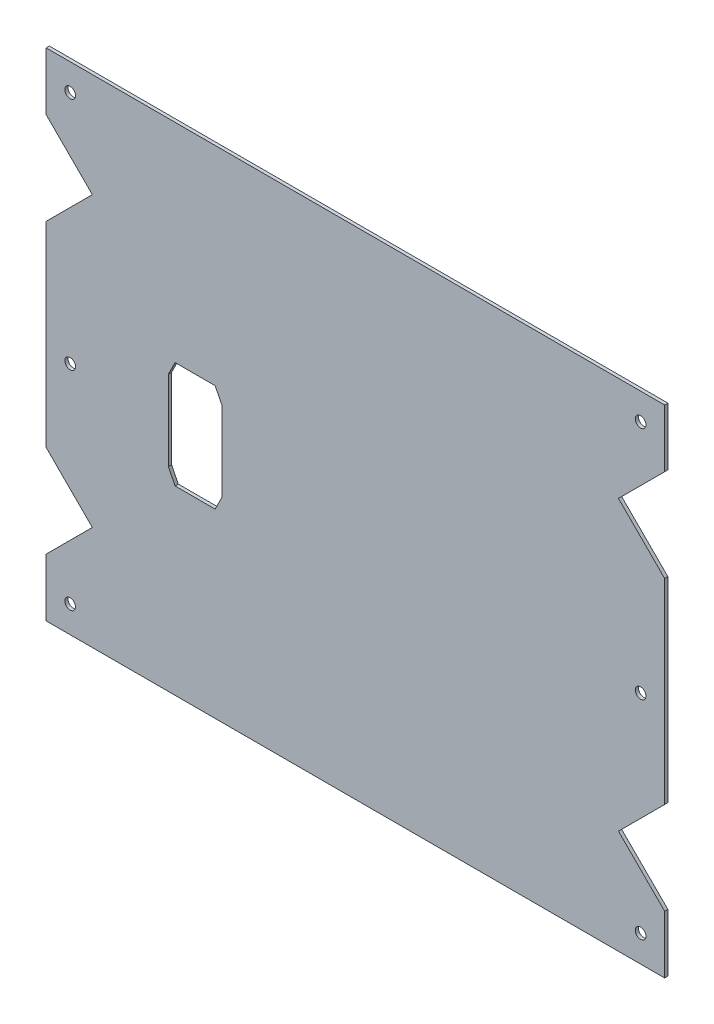
ISO-10303-21;
HEADER;
FILE_DESCRIPTION(('STEP AP214'),'2;1');
FILE_NAME('part.step','',(''),(''),'','','');
FILE_SCHEMA(('AUTOMOTIVE_DESIGN { 1 0 10303 214 1 1 1 1 }'));
ENDSEC;
DATA;
#1=APPLICATION_CONTEXT('core data for automotive mechanical design processes');
#2=APPLICATION_PROTOCOL_DEFINITION('international standard','automotive_design',2000,#1);
#3=PRODUCT_CONTEXT('',#1,'mechanical');
#4=PRODUCT('Part','Part','',(#3));
#5=PRODUCT_RELATED_PRODUCT_CATEGORY('part','',(#4));
#6=PRODUCT_DEFINITION_FORMATION('','',#4);
#7=PRODUCT_DEFINITION_CONTEXT('part definition',#1,'design');
#8=PRODUCT_DEFINITION('design','',#6,#7);
#9=PRODUCT_DEFINITION_SHAPE('','',#8);
#10=(LENGTH_UNIT() NAMED_UNIT(*) SI_UNIT(.MILLI.,.METRE.));
#11=(NAMED_UNIT(*) PLANE_ANGLE_UNIT() SI_UNIT($,.RADIAN.));
#12=(NAMED_UNIT(*) SI_UNIT($,.STERADIAN.) SOLID_ANGLE_UNIT());
#13=UNCERTAINTY_MEASURE_WITH_UNIT(LENGTH_MEASURE(1.E-05),#10,'distance_accuracy_value','');
#14=(GEOMETRIC_REPRESENTATION_CONTEXT(3) GLOBAL_UNCERTAINTY_ASSIGNED_CONTEXT((#13)) GLOBAL_UNIT_ASSIGNED_CONTEXT((#10,
#11,#12)) REPRESENTATION_CONTEXT('',''));
#15=CARTESIAN_POINT('',(0.,0.,0.));
#16=DIRECTION('',(0.,0.,1.));
#17=DIRECTION('',(1.,0.,0.));
#18=AXIS2_PLACEMENT_3D('',#15,#16,#17);
#19=CARTESIAN_POINT('',(0.,0.,1.2));
#20=DIRECTION('',(0.,0.,-1.));
#21=DIRECTION('',(-1.,0.,0.));
#22=AXIS2_PLACEMENT_3D('',#19,#20,#21);
#23=PLANE('',#22);
#24=DIRECTION('',(-0.707106781186554,0.707106781186541,0.));
#25=VECTOR('',#24,1.);
#26=CARTESIAN_POINT('',(207.565505420985,99.8549233047102,1.19999999999998));
#27=LINE('',#26,#25);
#28=CARTESIAN_POINT('',(215.773982116275,91.6464466094206,1.1999999999999));
#29=VERTEX_POINT('',#28);
#30=CARTESIAN_POINT('',(198.476911543767,108.943517181929,1.20000000000001));
#31=VERTEX_POINT('',#30);
#32=EDGE_CURVE('E709',#29,#31,#27,.T.);
#33=ORIENTED_EDGE('',*,*,#32,.T.);
#34=DIRECTION('',(0.707106781186549,0.707106781186546,0.));
#35=VECTOR('',#34,1.);
#36=CARTESIAN_POINT('',(226.597205420968,137.063811059131,1.19999999999942));
#37=LINE('',#36,#35);
#38=CARTESIAN_POINT('',(215.773982116275,126.240587754437,1.19999999999951));
#39=VERTEX_POINT('',#38);
#40=EDGE_CURVE('E624',#31,#39,#37,.T.);
#41=ORIENTED_EDGE('',*,*,#40,.T.);
#42=DIRECTION('',(0.,1.,0.));
#43=VECTOR('',#42,1.);
#44=CARTESIAN_POINT('',(215.773982116275,147.887034363824,1.19999999999935));
#45=LINE('',#44,#43);
#46=CARTESIAN_POINT('',(215.773982116275,147.887034363824,1.19999999999935));
#47=VERTEX_POINT('',#46);
#48=EDGE_CURVE('E630',#47,#39,#45,.F.);
#49=ORIENTED_EDGE('',*,*,#48,.F.);
#50=DIRECTION('',(1.,0.,0.));
#51=VECTOR('',#50,1.);
#52=CARTESIAN_POINT('',(215.773982116275,147.887034363824,1.19999999999935));
#53=LINE('',#52,#51);
#54=CARTESIAN_POINT('',(-15.7739821162846,147.887034363824,1.19999999999833));
#55=VERTEX_POINT('',#54);
#56=EDGE_CURVE('E622',#47,#55,#53,.F.);
#57=ORIENTED_EDGE('',*,*,#56,.T.);
#58=DIRECTION('',(0.,1.,0.));
#59=VECTOR('',#58,1.);
#60=CARTESIAN_POINT('',(-15.7739821162847,109.823634363824,1.19999999999913));
#61=LINE('',#60,#59);
#62=CARTESIAN_POINT('',(-15.7739821162846,126.240587754444,1.19999999999877));
#63=VERTEX_POINT('',#62);
#64=EDGE_CURVE('E641',#63,#55,#61,.T.);
#65=ORIENTED_EDGE('',*,*,#64,.F.);
#66=DIRECTION('',(0.707106781186559,-0.707106781186536,0.));
#67=VECTOR('',#66,1.);
#68=CARTESIAN_POINT('',(-7.56550542097494,118.032111059134,1.19999999999894));
#69=LINE('',#68,#67);
#70=CARTESIAN_POINT('',(1.52308845622177,108.943517181938,1.19999999999915));
#71=VERTEX_POINT('',#70);
#72=EDGE_CURVE('E620',#63,#71,#69,.T.);
#73=ORIENTED_EDGE('',*,*,#72,.T.);
#74=DIRECTION('',(-0.707106781186544,-0.707106781186551,0.));
#75=VECTOR('',#74,1.);
#76=CARTESIAN_POINT('',(-60.6289054210005,46.791523304715,1.19999999999919));
#77=LINE('',#76,#75);
#78=CARTESIAN_POINT('',(-15.7739821162848,91.6464466094312,1.19999999999887));
#79=VERTEX_POINT('',#78);
#80=EDGE_CURVE('E735',#71,#79,#77,.T.);
#81=ORIENTED_EDGE('',*,*,#80,.T.);
#82=DIRECTION('',(0.,1.,0.));
#83=VECTOR('',#82,1.);
#84=CARTESIAN_POINT('',(-15.7739821162851,1.93659999999996,1.1999999999995));
#85=LINE('',#84,#83);
#86=CARTESIAN_POINT('',(-15.773982116285,18.3535533906197,1.19999999999939));
#87=VERTEX_POINT('',#86);
#88=EDGE_CURVE('E741',#87,#79,#85,.T.);
#89=ORIENTED_EDGE('',*,*,#88,.F.);
#90=DIRECTION('',(0.707106781186547,-0.707106781186548,0.));
#91=VECTOR('',#90,1.);
#92=CARTESIAN_POINT('',(-7.56550542097516,10.1450766953098,1.19999999999944));
#93=LINE('',#92,#91);
#94=CARTESIAN_POINT('',(1.52308845624361,1.05648281809099,1.19999999999951));
#95=VERTEX_POINT('',#94);
#96=EDGE_CURVE('E733',#87,#95,#93,.T.);
#97=ORIENTED_EDGE('',*,*,#96,.T.);
#98=DIRECTION('',(-0.707106781186556,-0.707106781186539,0.));
#99=VECTOR('',#98,1.);
#100=CARTESIAN_POINT('',(-26.5972054209785,-27.0638110591305,1.19999999999894));
#101=LINE('',#100,#99);
#102=CARTESIAN_POINT('',(-15.7739821162848,-16.240587754437,1.19999999999902));
#103=VERTEX_POINT('',#102);
#104=EDGE_CURVE('E599',#95,#103,#101,.T.);
#105=ORIENTED_EDGE('',*,*,#104,.T.);
#106=DIRECTION('',(0.,1.,0.));
#107=VECTOR('',#106,1.);
#108=CARTESIAN_POINT('',(-15.7739821162848,-37.8870343638244,1.19999999999887));
#109=LINE('',#108,#107);
#110=CARTESIAN_POINT('',(-15.7739821162848,-37.8870343638244,1.19999999999887));
#111=VERTEX_POINT('',#110);
#112=EDGE_CURVE('E672',#111,#103,#109,.T.);
#113=ORIENTED_EDGE('',*,*,#112,.F.);
#114=DIRECTION('',(1.,0.,0.));
#115=VECTOR('',#114,1.);
#116=CARTESIAN_POINT('',(215.773982116274,-37.8870343638244,1.19999999999882));
#117=LINE('',#116,#115);
#118=CARTESIAN_POINT('',(215.773982116275,-37.8870343638241,1.19999999999882));
#119=VERTEX_POINT('',#118);
#120=EDGE_CURVE('E663',#111,#119,#117,.T.);
#121=ORIENTED_EDGE('',*,*,#120,.T.);
#122=DIRECTION('',(0.,1.,0.));
#123=VECTOR('',#122,1.);
#124=CARTESIAN_POINT('',(215.773982116275,0.176365636175637,1.19999999999962));
#125=LINE('',#124,#123);
#126=CARTESIAN_POINT('',(215.773982116275,-16.2405877544436,1.19999999999929));
#127=VERTEX_POINT('',#126);
#128=EDGE_CURVE('E681',#127,#119,#125,.F.);
#129=ORIENTED_EDGE('',*,*,#128,.F.);
#130=DIRECTION('',(-0.707106781186566,0.707106781186529,0.));
#131=VECTOR('',#130,1.);
#132=CARTESIAN_POINT('',(207.565505420965,-8.03211105913442,1.19999999999948));
#133=LINE('',#132,#131);
#134=CARTESIAN_POINT('',(198.476911543749,1.05648281808136,1.19999999999964));
#135=VERTEX_POINT('',#134);
#136=EDGE_CURVE('E666',#127,#135,#133,.T.);
#137=ORIENTED_EDGE('',*,*,#136,.T.);
#138=DIRECTION('',(0.707106781186537,0.707106781186558,0.));
#139=VECTOR('',#138,1.);
#140=CARTESIAN_POINT('',(260.628905420971,63.2084766953055,1.19999999999973));
#141=LINE('',#140,#139);
#142=CARTESIAN_POINT('',(215.773982116275,18.353553390608,1.1999999999994));
#143=VERTEX_POINT('',#142);
#144=EDGE_CURVE('E711',#135,#143,#141,.T.);
#145=ORIENTED_EDGE('',*,*,#144,.T.);
#146=DIRECTION('',(0.,1.,0.));
#147=VECTOR('',#146,1.);
#148=CARTESIAN_POINT('',(215.773982116275,108.0634,1.20000000000001));
#149=LINE('',#148,#147);
#150=EDGE_CURVE('E720',#29,#143,#149,.F.);
#151=ORIENTED_EDGE('',*,*,#150,.F.);
#152=EDGE_LOOP('',(#33,#41,#49,#57,#65,#73,#81,#89,#97,#105,#113,#121,#129,#137,#145,#151));
#153=FACE_BOUND('',#152,.T.);
#154=DIRECTION('',(0.44721359549996,-0.894427190999915,0.));
#155=VECTOR('',#154,1.);
#156=CARTESIAN_POINT('',(32.5,30.,1.2));
#157=LINE('',#156,#155);
#158=CARTESIAN_POINT('',(30.,35.,1.2));
#159=VERTEX_POINT('',#158);
#160=CARTESIAN_POINT('',(32.5,30.,1.2));
#161=VERTEX_POINT('',#160);
#162=EDGE_CURVE('E745',#159,#161,#157,.T.);
#163=ORIENTED_EDGE('',*,*,#162,.F.);
#164=DIRECTION('',(0.,-1.,0.));
#165=VECTOR('',#164,1.);
#166=CARTESIAN_POINT('',(30.,35.,1.2));
#167=LINE('',#166,#165);
#168=CARTESIAN_POINT('',(30.,65.,1.2));
#169=VERTEX_POINT('',#168);
#170=EDGE_CURVE('E760',#169,#159,#167,.T.);
#171=ORIENTED_EDGE('',*,*,#170,.F.);
#172=DIRECTION('',(-0.447213595499958,-0.894427190999916,0.));
#173=VECTOR('',#172,1.);
#174=CARTESIAN_POINT('',(30.,65.,1.2));
#175=LINE('',#174,#173);
#176=CARTESIAN_POINT('',(32.5,70.,1.2));
#177=VERTEX_POINT('',#176);
#178=EDGE_CURVE('E758',#177,#169,#175,.T.);
#179=ORIENTED_EDGE('',*,*,#178,.F.);
#180=DIRECTION('',(-1.,0.,0.));
#181=VECTOR('',#180,1.);
#182=CARTESIAN_POINT('',(32.5,70.,1.2));
#183=LINE('',#182,#181);
#184=CARTESIAN_POINT('',(47.5,70.,1.2));
#185=VERTEX_POINT('',#184);
#186=EDGE_CURVE('E756',#185,#177,#183,.T.);
#187=ORIENTED_EDGE('',*,*,#186,.F.);
#188=DIRECTION('',(-0.447213595499958,0.894427190999916,0.));
#189=VECTOR('',#188,1.);
#190=CARTESIAN_POINT('',(47.5,70.,1.2));
#191=LINE('',#190,#189);
#192=CARTESIAN_POINT('',(50.,65.,1.2));
#193=VERTEX_POINT('',#192);
#194=EDGE_CURVE('E754',#193,#185,#191,.T.);
#195=ORIENTED_EDGE('',*,*,#194,.F.);
#196=DIRECTION('',(0.,1.,0.));
#197=VECTOR('',#196,1.);
#198=CARTESIAN_POINT('',(50.,65.,1.2));
#199=LINE('',#198,#197);
#200=CARTESIAN_POINT('',(50.,35.,1.2));
#201=VERTEX_POINT('',#200);
#202=EDGE_CURVE('E752',#201,#193,#199,.T.);
#203=ORIENTED_EDGE('',*,*,#202,.F.);
#204=DIRECTION('',(0.447213595499959,0.894427190999915,0.));
#205=VECTOR('',#204,1.);
#206=CARTESIAN_POINT('',(50.,35.,1.2));
#207=LINE('',#206,#205);
#208=CARTESIAN_POINT('',(47.5,30.,1.2));
#209=VERTEX_POINT('',#208);
#210=EDGE_CURVE('E750',#209,#201,#207,.T.);
#211=ORIENTED_EDGE('',*,*,#210,.F.);
#212=DIRECTION('',(1.,0.,0.));
#213=VECTOR('',#212,1.);
#214=CARTESIAN_POINT('',(47.5,30.,1.2));
#215=LINE('',#214,#213);
#216=EDGE_CURVE('E747',#161,#209,#215,.T.);
#217=ORIENTED_EDGE('',*,*,#216,.F.);
#218=EDGE_LOOP('',(#163,#171,#179,#187,#195,#203,#211,#217));
#219=FACE_BOUND('',#218,.T.);
#220=CARTESIAN_POINT('',(-6.77398211628597,49.9999999999993,1.19999999999917));
#221=DIRECTION('',(0.,0.,1.));
#222=DIRECTION('',(1.,0.,0.));
#223=AXIS2_PLACEMENT_3D('',#220,#221,#222);
#224=CIRCLE('',#223,2.);
#225=CARTESIAN_POINT('',(-4.77398211628597,49.9999999999993,1.19999999999917));
#226=VERTEX_POINT('',#225);
#227=EDGE_CURVE('E738',#226,#226,#224,.T.);
#228=ORIENTED_EDGE('',*,*,#227,.F.);
#229=EDGE_LOOP('',(#228));
#230=FACE_BOUND('',#229,.T.);
#231=CARTESIAN_POINT('',(206.773982116151,49.9999999999994,1.19999999999959));
#232=DIRECTION('',(0.,0.,1.));
#233=DIRECTION('',(1.,0.,0.));
#234=AXIS2_PLACEMENT_3D('',#231,#232,#233);
#235=CIRCLE('',#234,2.);
#236=CARTESIAN_POINT('',(208.773982116151,49.9999999999994,1.19999999999959));
#237=VERTEX_POINT('',#236);
#238=EDGE_CURVE('E717',#237,#237,#235,.T.);
#239=ORIENTED_EDGE('',*,*,#238,.F.);
#240=EDGE_LOOP('',(#239));
#241=FACE_BOUND('',#240,.T.);
#242=CARTESIAN_POINT('',(-6.77398211628428,-27.8870343639498,1.19999999999893));
#243=DIRECTION('',(0.,0.,1.));
#244=DIRECTION('',(0.,1.,0.));
#245=AXIS2_PLACEMENT_3D('',#242,#243,#244);
#246=CIRCLE('',#245,2.);
#247=CARTESIAN_POINT('',(-6.77398211628427,-25.8870343639498,1.19999999999895));
#248=VERTEX_POINT('',#247);
#249=EDGE_CURVE('E686',#248,#248,#246,.T.);
#250=ORIENTED_EDGE('',*,*,#249,.F.);
#251=EDGE_LOOP('',(#250));
#252=FACE_BOUND('',#251,.T.);
#253=CARTESIAN_POINT('',(206.773982116274,-27.887034363825,1.19999999999905));
#254=DIRECTION('',(0.,0.,1.));
#255=DIRECTION('',(-1.,0.,0.));
#256=AXIS2_PLACEMENT_3D('',#253,#254,#255);
#257=CIRCLE('',#256,2.);
#258=CARTESIAN_POINT('',(204.773982116274,-27.887034363825,1.19999999999905));
#259=VERTEX_POINT('',#258);
#260=EDGE_CURVE('E614',#259,#259,#257,.T.);
#261=ORIENTED_EDGE('',*,*,#260,.F.);
#262=EDGE_LOOP('',(#261));
#263=FACE_BOUND('',#262,.T.);
#264=CARTESIAN_POINT('',(-6.77398211628501,137.88703436395,1.19999999999852));
#265=DIRECTION('',(0.,0.,1.));
#266=DIRECTION('',(0.,-1.,0.));
#267=AXIS2_PLACEMENT_3D('',#264,#265,#266);
#268=CIRCLE('',#267,2.);
#269=CARTESIAN_POINT('',(-6.77398211628497,135.88703436395,1.19999999999856));
#270=VERTEX_POINT('',#269);
#271=EDGE_CURVE('E651',#270,#270,#268,.T.);
#272=ORIENTED_EDGE('',*,*,#271,.F.);
#273=EDGE_LOOP('',(#272));
#274=FACE_BOUND('',#273,.T.);
#275=CARTESIAN_POINT('',(206.773982116274,137.887034363825,1.19999999999941));
#276=DIRECTION('',(0.,0.,1.));
#277=DIRECTION('',(1.,0.,0.));
#278=AXIS2_PLACEMENT_3D('',#275,#276,#277);
#279=CIRCLE('',#278,2.);
#280=CARTESIAN_POINT('',(208.773982116274,137.887034363825,1.19999999999941));
#281=VERTEX_POINT('',#280);
#282=EDGE_CURVE('E611',#281,#281,#279,.T.);
#283=ORIENTED_EDGE('',*,*,#282,.F.);
#284=EDGE_LOOP('',(#283));
#285=FACE_BOUND('',#284,.T.);
#286=ADVANCED_FACE('F411',(#153,#219,#230,#241,#252,#263,#274,#285),#23,.F.);
#287=CARTESIAN_POINT('',(0.,0.,0.));
#288=DIRECTION('',(0.,0.,-1.));
#289=DIRECTION('',(-1.,0.,0.));
#290=AXIS2_PLACEMENT_3D('',#287,#288,#289);
#291=PLANE('',#290);
#292=DIRECTION('',(0.707106781186549,0.707106781186546,0.));
#293=VECTOR('',#292,1.);
#294=CARTESIAN_POINT('',(226.597205420968,137.063811059131,-5.82867087928207E-13));
#295=LINE('',#294,#293);
#296=CARTESIAN_POINT('',(198.476911543767,108.943517181929,0.));
#297=VERTEX_POINT('',#296);
#298=CARTESIAN_POINT('',(215.773982116275,126.240587754437,-4.9960036108132E-13));
#299=VERTEX_POINT('',#298);
#300=EDGE_CURVE('E615',#297,#299,#295,.T.);
#301=ORIENTED_EDGE('',*,*,#300,.F.);
#302=DIRECTION('',(-0.707106781186554,0.707106781186541,0.));
#303=VECTOR('',#302,1.);
#304=CARTESIAN_POINT('',(207.565505420985,99.8549233047102,0.));
#305=LINE('',#304,#303);
#306=CARTESIAN_POINT('',(215.773982116275,91.6464466094206,-1.11022302462516E-13));
#307=VERTEX_POINT('',#306);
#308=EDGE_CURVE('E699',#307,#297,#305,.T.);
#309=ORIENTED_EDGE('',*,*,#308,.F.);
#310=DIRECTION('',(0.,1.,0.));
#311=VECTOR('',#310,1.);
#312=CARTESIAN_POINT('',(215.773982116275,108.0634,0.));
#313=LINE('',#312,#311);
#314=CARTESIAN_POINT('',(215.773982116275,18.353553390608,-6.10622663543836E-13));
#315=VERTEX_POINT('',#314);
#316=EDGE_CURVE('E701',#307,#315,#313,.F.);
#317=ORIENTED_EDGE('',*,*,#316,.T.);
#318=DIRECTION('',(0.707106781186537,0.707106781186558,0.));
#319=VECTOR('',#318,1.);
#320=CARTESIAN_POINT('',(260.628905420971,63.2084766953055,-2.77555756156289E-13));
#321=LINE('',#320,#319);
#322=CARTESIAN_POINT('',(198.476911543749,1.05648281808139,-3.6125616387217E-13));
#323=VERTEX_POINT('',#322);
#324=EDGE_CURVE('E706',#323,#315,#321,.T.);
#325=ORIENTED_EDGE('',*,*,#324,.F.);
#326=DIRECTION('',(-0.707106781186566,0.707106781186529,0.));
#327=VECTOR('',#326,1.);
#328=CARTESIAN_POINT('',(207.565505420965,-8.0321110591344,-5.23506247317324E-13));
#329=LINE('',#328,#327);
#330=CARTESIAN_POINT('',(215.773982116275,-16.2405877544436,-7.19907650602707E-13));
#331=VERTEX_POINT('',#330);
#332=EDGE_CURVE('E594',#331,#323,#329,.T.);
#333=ORIENTED_EDGE('',*,*,#332,.F.);
#334=DIRECTION('',(0.,1.,0.));
#335=VECTOR('',#334,1.);
#336=CARTESIAN_POINT('',(215.773982116275,0.176365636175661,-3.85032408042413E-13));
#337=LINE('',#336,#335);
#338=CARTESIAN_POINT('',(215.773982116275,-37.8870343638241,-1.18406387361043E-12));
#339=VERTEX_POINT('',#338);
#340=EDGE_CURVE('E678',#331,#339,#337,.F.);
#341=ORIENTED_EDGE('',*,*,#340,.T.);
#342=DIRECTION('',(1.,0.,0.));
#343=VECTOR('',#342,1.);
#344=CARTESIAN_POINT('',(215.773982116274,-37.8870343638244,-1.18406387361043E-12));
#345=LINE('',#344,#343);
#346=CARTESIAN_POINT('',(-15.7739821162848,-37.8870343638244,-1.13438163367224E-12));
#347=VERTEX_POINT('',#346);
#348=EDGE_CURVE('E691',#347,#339,#345,.T.);
#349=ORIENTED_EDGE('',*,*,#348,.F.);
#350=DIRECTION('',(0.,1.,0.));
#351=VECTOR('',#350,1.);
#352=CARTESIAN_POINT('',(-15.7739821162848,-37.8870343638244,-1.13438163367224E-12));
#353=LINE('',#352,#351);
#354=CARTESIAN_POINT('',(-15.7739821162848,-16.240587754437,-9.83334098929737E-13));
#355=VERTEX_POINT('',#354);
#356=EDGE_CURVE('E591',#347,#355,#353,.T.);
#357=ORIENTED_EDGE('',*,*,#356,.T.);
#358=DIRECTION('',(-0.707106781186556,-0.707106781186539,0.));
#359=VECTOR('',#358,1.);
#360=CARTESIAN_POINT('',(-26.5972054209785,-27.0638110591305,-1.0566020638446E-12));
#361=LINE('',#360,#359);
#362=CARTESIAN_POINT('',(1.52308845624361,1.05648281809098,-4.93095148046407E-13));
#363=VERTEX_POINT('',#362);
#364=EDGE_CURVE('E587',#363,#355,#361,.T.);
#365=ORIENTED_EDGE('',*,*,#364,.F.);
#366=DIRECTION('',(0.707106781186547,-0.707106781186548,0.));
#367=VECTOR('',#366,1.);
#368=CARTESIAN_POINT('',(-7.56550542097516,10.1450766953098,-5.56016695999748E-13));
#369=LINE('',#368,#367);
#370=CARTESIAN_POINT('',(-15.773982116285,18.3535533906197,-6.12874813590876E-13));
#371=VERTEX_POINT('',#370);
#372=EDGE_CURVE('E573',#371,#363,#369,.T.);
#373=ORIENTED_EDGE('',*,*,#372,.F.);
#374=DIRECTION('',(0.,1.,0.));
#375=VECTOR('',#374,1.);
#376=CARTESIAN_POINT('',(-15.7739821162851,1.93659999999995,-4.98153329937543E-13));
#377=LINE('',#376,#375);
#378=CARTESIAN_POINT('',(-15.7739821162848,91.6464466094312,-1.125044718155E-12));
#379=VERTEX_POINT('',#378);
#380=EDGE_CURVE('E583',#371,#379,#377,.T.);
#381=ORIENTED_EDGE('',*,*,#380,.T.);
#382=DIRECTION('',(-0.707106781186544,-0.707106781186551,0.));
#383=VECTOR('',#382,1.);
#384=CARTESIAN_POINT('',(-60.6289054210005,46.791523304715,-8.08852452133712E-13));
#385=LINE('',#384,#383);
#386=CARTESIAN_POINT('',(1.52308845622177,108.943517181938,-8.50231343663133E-13));
#387=VERTEX_POINT('',#386);
#388=EDGE_CURVE('E730',#387,#379,#385,.T.);
#389=ORIENTED_EDGE('',*,*,#388,.F.);
#390=DIRECTION('',(0.707106781186559,-0.707106781186536,0.));
#391=VECTOR('',#390,1.);
#392=CARTESIAN_POINT('',(-7.56550542097494,118.032111059134,-1.0547118733939E-12));
#393=LINE('',#392,#391);
#394=CARTESIAN_POINT('',(-15.7739821162846,126.240587754444,-1.23512311489549E-12));
#395=VERTEX_POINT('',#394);
#396=EDGE_CURVE('E618',#395,#387,#393,.T.);
#397=ORIENTED_EDGE('',*,*,#396,.F.);
#398=DIRECTION('',(0.,1.,0.));
#399=VECTOR('',#398,1.);
#400=CARTESIAN_POINT('',(-15.7739821162847,109.823634363824,-8.74300631892311E-13));
#401=LINE('',#400,#399);
#402=CARTESIAN_POINT('',(-15.7739821162846,147.887034363824,-1.67921232474555E-12));
#403=VERTEX_POINT('',#402);
#404=EDGE_CURVE('E635',#395,#403,#401,.T.);
#405=ORIENTED_EDGE('',*,*,#404,.T.);
#406=DIRECTION('',(1.,0.,0.));
#407=VECTOR('',#406,1.);
#408=CARTESIAN_POINT('',(215.773982116275,147.887034363824,-6.52256026967279E-13));
#409=LINE('',#408,#407);
#410=CARTESIAN_POINT('',(215.773982116275,147.887034363824,-6.52256026967279E-13));
#411=VERTEX_POINT('',#410);
#412=EDGE_CURVE('E649',#411,#403,#409,.F.);
#413=ORIENTED_EDGE('',*,*,#412,.F.);
#414=DIRECTION('',(0.,1.,0.));
#415=VECTOR('',#414,1.);
#416=CARTESIAN_POINT('',(215.773982116275,147.887034363824,-6.52256026967279E-13));
#417=LINE('',#416,#415);
#418=EDGE_CURVE('E627',#411,#299,#417,.F.);
#419=ORIENTED_EDGE('',*,*,#418,.T.);
#420=EDGE_LOOP('',(#301,#309,#317,#325,#333,#341,#349,#357,#365,#373,#381,#389,#397,#405,#413,#419));
#421=FACE_BOUND('',#420,.T.);
#422=DIRECTION('',(0.,-1.,0.));
#423=VECTOR('',#422,1.);
#424=CARTESIAN_POINT('',(30.,35.,0.));
#425=LINE('',#424,#423);
#426=CARTESIAN_POINT('',(30.,65.,0.));
#427=VERTEX_POINT('',#426);
#428=CARTESIAN_POINT('',(30.,35.,0.));
#429=VERTEX_POINT('',#428);
#430=EDGE_CURVE('E748',#427,#429,#425,.T.);
#431=ORIENTED_EDGE('',*,*,#430,.T.);
#432=DIRECTION('',(0.44721359549996,-0.894427190999915,0.));
#433=VECTOR('',#432,1.);
#434=CARTESIAN_POINT('',(32.5,30.,0.));
#435=LINE('',#434,#433);
#436=CARTESIAN_POINT('',(32.5,30.,0.));
#437=VERTEX_POINT('',#436);
#438=EDGE_CURVE('E433',#429,#437,#435,.T.);
#439=ORIENTED_EDGE('',*,*,#438,.T.);
#440=DIRECTION('',(1.,0.,0.));
#441=VECTOR('',#440,1.);
#442=CARTESIAN_POINT('',(47.5,30.,0.));
#443=LINE('',#442,#441);
#444=CARTESIAN_POINT('',(47.5,30.,0.));
#445=VERTEX_POINT('',#444);
#446=EDGE_CURVE('E764',#437,#445,#443,.T.);
#447=ORIENTED_EDGE('',*,*,#446,.T.);
#448=DIRECTION('',(0.447213595499959,0.894427190999915,0.));
#449=VECTOR('',#448,1.);
#450=CARTESIAN_POINT('',(50.,35.,0.));
#451=LINE('',#450,#449);
#452=CARTESIAN_POINT('',(50.,35.,0.));
#453=VERTEX_POINT('',#452);
#454=EDGE_CURVE('E767',#445,#453,#451,.T.);
#455=ORIENTED_EDGE('',*,*,#454,.T.);
#456=DIRECTION('',(0.,1.,0.));
#457=VECTOR('',#456,1.);
#458=CARTESIAN_POINT('',(50.,65.,0.));
#459=LINE('',#458,#457);
#460=CARTESIAN_POINT('',(50.,65.,0.));
#461=VERTEX_POINT('',#460);
#462=EDGE_CURVE('E770',#453,#461,#459,.T.);
#463=ORIENTED_EDGE('',*,*,#462,.T.);
#464=DIRECTION('',(-0.447213595499958,0.894427190999916,0.));
#465=VECTOR('',#464,1.);
#466=CARTESIAN_POINT('',(47.5,70.,0.));
#467=LINE('',#466,#465);
#468=CARTESIAN_POINT('',(47.5,70.,0.));
#469=VERTEX_POINT('',#468);
#470=EDGE_CURVE('E773',#461,#469,#467,.T.);
#471=ORIENTED_EDGE('',*,*,#470,.T.);
#472=DIRECTION('',(-1.,0.,0.));
#473=VECTOR('',#472,1.);
#474=CARTESIAN_POINT('',(32.5,70.,0.));
#475=LINE('',#474,#473);
#476=CARTESIAN_POINT('',(32.5,70.,0.));
#477=VERTEX_POINT('',#476);
#478=EDGE_CURVE('E776',#469,#477,#475,.T.);
#479=ORIENTED_EDGE('',*,*,#478,.T.);
#480=DIRECTION('',(-0.447213595499958,-0.894427190999916,0.));
#481=VECTOR('',#480,1.);
#482=CARTESIAN_POINT('',(30.,65.,0.));
#483=LINE('',#482,#481);
#484=EDGE_CURVE('E779',#477,#427,#483,.T.);
#485=ORIENTED_EDGE('',*,*,#484,.T.);
#486=EDGE_LOOP('',(#431,#439,#447,#455,#463,#471,#479,#485));
#487=FACE_BOUND('',#486,.T.);
#488=CARTESIAN_POINT('',(-6.77398211628673,49.9999999999993,-2.04577628740258E-11));
#489=DIRECTION('',(6.3072958938397E-13,0.,1.));
#490=DIRECTION('',(1.,0.,-6.3072958938397E-13));
#491=AXIS2_PLACEMENT_3D('',#488,#489,#490);
#492=CIRCLE('',#491,2.);
#493=CARTESIAN_POINT('',(-4.77398211628673,49.9999999999993,-2.17192220527937E-11));
#494=VERTEX_POINT('',#493);
#495=EDGE_CURVE('E725',#494,#494,#492,.T.);
#496=ORIENTED_EDGE('',*,*,#495,.T.);
#497=EDGE_LOOP('',(#496));
#498=FACE_BOUND('',#497,.T.);
#499=CARTESIAN_POINT('',(206.773982116151,49.9999999999994,-4.16333634234434E-13));
#500=DIRECTION('',(0.,0.,-1.));
#501=DIRECTION('',(-1.,0.,0.));
#502=AXIS2_PLACEMENT_3D('',#499,#500,#501);
#503=CIRCLE('',#502,2.);
#504=CARTESIAN_POINT('',(204.773982116151,49.9999999999994,-4.16776830010351E-13));
#505=VERTEX_POINT('',#504);
#506=EDGE_CURVE('E714',#505,#505,#503,.T.);
#507=ORIENTED_EDGE('',*,*,#506,.F.);
#508=EDGE_LOOP('',(#507));
#509=FACE_BOUND('',#508,.T.);
#510=CARTESIAN_POINT('',(-6.77398211628428,-27.8870343639505,-7.4502604598589E-12));
#511=DIRECTION('',(0.,6.23690420319885E-13,1.));
#512=DIRECTION('',(0.,1.,-6.23690420319885E-13));
#513=AXIS2_PLACEMENT_3D('',#510,#511,#512);
#514=CIRCLE('',#513,2.);
#515=CARTESIAN_POINT('',(-6.77398211628427,-25.8870343639505,-8.69764130049867E-12));
#516=VERTEX_POINT('',#515);
#517=EDGE_CURVE('E669',#516,#516,#514,.T.);
#518=ORIENTED_EDGE('',*,*,#517,.T.);
#519=EDGE_LOOP('',(#518));
#520=FACE_BOUND('',#519,.T.);
#521=CARTESIAN_POINT('',(206.773982116274,-27.8870343638242,-1.41929448887948E-11));
#522=DIRECTION('',(6.30742764846099E-13,6.51462759999931E-13,-1.));
#523=DIRECTION('',(0.,1.,6.5146275999992E-13));
#524=AXIS2_PLACEMENT_3D('',#521,#522,#523);
#525=CIRCLE('',#524,2.);
#526=CARTESIAN_POINT('',(206.773982116274,-25.8870343638242,-1.2890019368795E-11));
#527=VERTEX_POINT('',#526);
#528=EDGE_CURVE('E694',#527,#527,#525,.T.);
#529=ORIENTED_EDGE('',*,*,#528,.F.);
#530=EDGE_LOOP('',(#529));
#531=FACE_BOUND('',#530,.T.);
#532=CARTESIAN_POINT('',(206.773982116275,137.887034363824,-1.38639100200066E-11));
#533=DIRECTION('',(6.30889954931965E-13,-6.37805804798839E-13,-1.));
#534=DIRECTION('',(0.,-1.,6.37805804798837E-13));
#535=AXIS2_PLACEMENT_3D('',#532,#533,#534);
#536=CIRCLE('',#535,2.);
#537=CARTESIAN_POINT('',(206.773982116275,135.887034363824,-1.2588298410409E-11));
#538=VERTEX_POINT('',#537);
#539=EDGE_CURVE('E654',#538,#538,#536,.T.);
#540=ORIENTED_EDGE('',*,*,#539,.F.);
#541=EDGE_LOOP('',(#540));
#542=FACE_BOUND('',#541,.T.);
#543=CARTESIAN_POINT('',(-6.77398211628501,137.88703436395,-7.79931674799172E-12));
#544=DIRECTION('',(0.,-6.09714443057395E-13,1.));
#545=DIRECTION('',(0.,-1.,-6.09714443057395E-13));
#546=AXIS2_PLACEMENT_3D('',#543,#544,#545);
#547=CIRCLE('',#546,2.);
#548=CARTESIAN_POINT('',(-6.77398211628497,135.88703436395,-9.01874563410652E-12));
#549=VERTEX_POINT('',#548);
#550=EDGE_CURVE('E638',#549,#549,#547,.T.);
#551=ORIENTED_EDGE('',*,*,#550,.T.);
#552=EDGE_LOOP('',(#551));
#553=FACE_BOUND('',#552,.T.);
#554=ADVANCED_FACE('F413',(#421,#487,#498,#509,#520,#531,#542,#553),#291,.T.);
#555=CARTESIAN_POINT('',(32.5,30.,1.2));
#556=DIRECTION('',(0.894427190999915,0.44721359549996,0.));
#557=DIRECTION('',(-0.44721359549996,0.894427190999915,0.));
#558=AXIS2_PLACEMENT_3D('',#555,#556,#557);
#559=PLANE('',#558);
#560=ORIENTED_EDGE('',*,*,#438,.F.);
#561=DIRECTION('',(0.,0.,-1.));
#562=VECTOR('',#561,1.);
#563=CARTESIAN_POINT('',(30.,35.,1.2));
#564=LINE('',#563,#562);
#565=EDGE_CURVE('E762',#159,#429,#564,.T.);
#566=ORIENTED_EDGE('',*,*,#565,.F.);
#567=ORIENTED_EDGE('',*,*,#162,.T.);
#568=DIRECTION('',(0.,0.,-1.));
#569=VECTOR('',#568,1.);
#570=CARTESIAN_POINT('',(32.5,30.,1.2));
#571=LINE('',#570,#569);
#572=EDGE_CURVE('E13',#161,#437,#571,.T.);
#573=ORIENTED_EDGE('',*,*,#572,.T.);
#574=EDGE_LOOP('',(#560,#566,#567,#573));
#575=FACE_BOUND('',#574,.T.);
#576=ADVANCED_FACE('F809',(#575),#559,.T.);
#577=CARTESIAN_POINT('',(47.5,30.,1.2));
#578=DIRECTION('',(0.,1.,0.));
#579=DIRECTION('',(0.,0.,1.));
#580=AXIS2_PLACEMENT_3D('',#577,#578,#579);
#581=PLANE('',#580);
#582=ORIENTED_EDGE('',*,*,#446,.F.);
#583=ORIENTED_EDGE('',*,*,#572,.F.);
#584=ORIENTED_EDGE('',*,*,#216,.T.);
#585=DIRECTION('',(0.,0.,-1.));
#586=VECTOR('',#585,1.);
#587=CARTESIAN_POINT('',(47.5,30.,1.2));
#588=LINE('',#587,#586);
#589=EDGE_CURVE('E419',#209,#445,#588,.T.);
#590=ORIENTED_EDGE('',*,*,#589,.T.);
#591=EDGE_LOOP('',(#582,#583,#584,#590));
#592=FACE_BOUND('',#591,.T.);
#593=ADVANCED_FACE('F796',(#592),#581,.T.);
#594=CARTESIAN_POINT('',(50.,35.,1.2));
#595=DIRECTION('',(-0.894427190999915,0.447213595499959,0.));
#596=DIRECTION('',(-0.447213595499959,-0.894427190999915,0.));
#597=AXIS2_PLACEMENT_3D('',#594,#595,#596);
#598=PLANE('',#597);
#599=ORIENTED_EDGE('',*,*,#454,.F.);
#600=ORIENTED_EDGE('',*,*,#589,.F.);
#601=ORIENTED_EDGE('',*,*,#210,.T.);
#602=DIRECTION('',(0.,0.,-1.));
#603=VECTOR('',#602,1.);
#604=CARTESIAN_POINT('',(50.,35.,1.2));
#605=LINE('',#604,#603);
#606=EDGE_CURVE('E792',#201,#453,#605,.T.);
#607=ORIENTED_EDGE('',*,*,#606,.T.);
#608=EDGE_LOOP('',(#599,#600,#601,#607));
#609=FACE_BOUND('',#608,.T.);
#610=ADVANCED_FACE('F801',(#609),#598,.T.);
#611=CARTESIAN_POINT('',(50.,65.,1.2));
#612=DIRECTION('',(-1.,0.,0.));
#613=DIRECTION('',(0.,-1.,0.));
#614=AXIS2_PLACEMENT_3D('',#611,#612,#613);
#615=PLANE('',#614);
#616=ORIENTED_EDGE('',*,*,#462,.F.);
#617=ORIENTED_EDGE('',*,*,#606,.F.);
#618=ORIENTED_EDGE('',*,*,#202,.T.);
#619=DIRECTION('',(0.,0.,-1.));
#620=VECTOR('',#619,1.);
#621=CARTESIAN_POINT('',(50.,65.,1.2));
#622=LINE('',#621,#620);
#623=EDGE_CURVE('E790',#193,#461,#622,.T.);
#624=ORIENTED_EDGE('',*,*,#623,.T.);
#625=EDGE_LOOP('',(#616,#617,#618,#624));
#626=FACE_BOUND('',#625,.T.);
#627=ADVANCED_FACE('F816',(#626),#615,.T.);
#628=CARTESIAN_POINT('',(47.5,70.,1.2));
#629=DIRECTION('',(-0.894427190999916,-0.447213595499958,0.));
#630=DIRECTION('',(0.447213595499958,-0.894427190999916,0.));
#631=AXIS2_PLACEMENT_3D('',#628,#629,#630);
#632=PLANE('',#631);
#633=ORIENTED_EDGE('',*,*,#470,.F.);
#634=ORIENTED_EDGE('',*,*,#623,.F.);
#635=ORIENTED_EDGE('',*,*,#194,.T.);
#636=DIRECTION('',(0.,0.,-1.));
#637=VECTOR('',#636,1.);
#638=CARTESIAN_POINT('',(47.5,70.,1.2));
#639=LINE('',#638,#637);
#640=EDGE_CURVE('E788',#185,#469,#639,.T.);
#641=ORIENTED_EDGE('',*,*,#640,.T.);
#642=EDGE_LOOP('',(#633,#634,#635,#641));
#643=FACE_BOUND('',#642,.T.);
#644=ADVANCED_FACE('F821',(#643),#632,.T.);
#645=CARTESIAN_POINT('',(32.5,70.,1.2));
#646=DIRECTION('',(0.,-1.,0.));
#647=DIRECTION('',(0.,0.,-1.));
#648=AXIS2_PLACEMENT_3D('',#645,#646,#647);
#649=PLANE('',#648);
#650=ORIENTED_EDGE('',*,*,#478,.F.);
#651=ORIENTED_EDGE('',*,*,#640,.F.);
#652=ORIENTED_EDGE('',*,*,#186,.T.);
#653=DIRECTION('',(0.,0.,-1.));
#654=VECTOR('',#653,1.);
#655=CARTESIAN_POINT('',(32.5,70.,1.2));
#656=LINE('',#655,#654);
#657=EDGE_CURVE('E786',#177,#477,#656,.T.);
#658=ORIENTED_EDGE('',*,*,#657,.T.);
#659=EDGE_LOOP('',(#650,#651,#652,#658));
#660=FACE_BOUND('',#659,.T.);
#661=ADVANCED_FACE('F825',(#660),#649,.T.);
#662=CARTESIAN_POINT('',(30.,65.,1.2));
#663=DIRECTION('',(0.894427190999916,-0.447213595499958,0.));
#664=DIRECTION('',(0.447213595499958,0.894427190999916,0.));
#665=AXIS2_PLACEMENT_3D('',#662,#663,#664);
#666=PLANE('',#665);
#667=ORIENTED_EDGE('',*,*,#484,.F.);
#668=ORIENTED_EDGE('',*,*,#657,.F.);
#669=ORIENTED_EDGE('',*,*,#178,.T.);
#670=DIRECTION('',(0.,0.,-1.));
#671=VECTOR('',#670,1.);
#672=CARTESIAN_POINT('',(30.,65.,1.2));
#673=LINE('',#672,#671);
#674=EDGE_CURVE('E426',#169,#427,#673,.T.);
#675=ORIENTED_EDGE('',*,*,#674,.T.);
#676=EDGE_LOOP('',(#667,#668,#669,#675));
#677=FACE_BOUND('',#676,.T.);
#678=ADVANCED_FACE('F828',(#677),#666,.T.);
#679=CARTESIAN_POINT('',(30.,35.,1.2));
#680=DIRECTION('',(1.,0.,0.));
#681=DIRECTION('',(0.,0.,-1.));
#682=AXIS2_PLACEMENT_3D('',#679,#680,#681);
#683=PLANE('',#682);
#684=ORIENTED_EDGE('',*,*,#430,.F.);
#685=ORIENTED_EDGE('',*,*,#674,.F.);
#686=ORIENTED_EDGE('',*,*,#170,.T.);
#687=ORIENTED_EDGE('',*,*,#565,.T.);
#688=EDGE_LOOP('',(#684,#685,#686,#687));
#689=FACE_BOUND('',#688,.T.);
#690=ADVANCED_FACE('F806',(#689),#683,.T.);
#691=CARTESIAN_POINT('',(-15.7739821162851,1.93659999999995,-4.98153329937543E-13));
#692=DIRECTION('',(1.,0.,0.));
#693=DIRECTION('',(0.,1.,0.));
#694=AXIS2_PLACEMENT_3D('',#691,#692,#693);
#695=PLANE('',#694);
#696=DIRECTION('',(0.,0.,1.));
#697=VECTOR('',#696,1.);
#698=CARTESIAN_POINT('',(-15.7739821162848,91.6464466094312,-1.125044718155E-12));
#699=LINE('',#698,#697);
#700=EDGE_CURVE('E728',#379,#79,#699,.T.);
#701=ORIENTED_EDGE('',*,*,#700,.F.);
#702=ORIENTED_EDGE('',*,*,#380,.F.);
#703=DIRECTION('',(0.,0.,1.));
#704=VECTOR('',#703,1.);
#705=CARTESIAN_POINT('',(-15.773982116285,18.3535533906197,-6.12874813590876E-13));
#706=LINE('',#705,#704);
#707=EDGE_CURVE('E579',#371,#87,#706,.T.);
#708=ORIENTED_EDGE('',*,*,#707,.T.);
#709=ORIENTED_EDGE('',*,*,#88,.T.);
#710=EDGE_LOOP('',(#701,#702,#708,#709));
#711=FACE_BOUND('',#710,.T.);
#712=ADVANCED_FACE('F835',(#711),#695,.F.);
#713=CARTESIAN_POINT('',(-6.77398211628673,49.9999999999993,-2.04577628740258E-11));
#714=DIRECTION('',(6.3072958938397E-13,0.,1.));
#715=DIRECTION('',(1.,0.,-6.3072958938397E-13));
#716=AXIS2_PLACEMENT_3D('',#713,#714,#715);
#717=CYLINDRICAL_SURFACE('',#716,2.);
#718=ORIENTED_EDGE('',*,*,#227,.T.);
#719=EDGE_LOOP('',(#718));
#720=FACE_BOUND('',#719,.T.);
#721=ORIENTED_EDGE('',*,*,#495,.F.);
#722=EDGE_LOOP('',(#721));
#723=FACE_BOUND('',#722,.T.);
#724=ADVANCED_FACE('F907',(#720,#723),#717,.F.);
#725=CARTESIAN_POINT('',(-60.6289054210005,46.791523304715,-8.08852452133712E-13));
#726=DIRECTION('',(-0.707106781186551,0.707106781186544,0.));
#727=DIRECTION('',(-0.707106781186544,-0.707106781186551,0.));
#728=AXIS2_PLACEMENT_3D('',#725,#726,#727);
#729=PLANE('',#728);
#730=ORIENTED_EDGE('',*,*,#388,.T.);
#731=ORIENTED_EDGE('',*,*,#700,.T.);
#732=ORIENTED_EDGE('',*,*,#80,.F.);
#733=DIRECTION('',(0.,0.,1.));
#734=VECTOR('',#733,1.);
#735=CARTESIAN_POINT('',(1.52308845622177,108.943517181938,-8.50231343663133E-13));
#736=LINE('',#735,#734);
#737=EDGE_CURVE('E608',#387,#71,#736,.T.);
#738=ORIENTED_EDGE('',*,*,#737,.F.);
#739=EDGE_LOOP('',(#730,#731,#732,#738));
#740=FACE_BOUND('',#739,.T.);
#741=ADVANCED_FACE('F918',(#740),#729,.T.);
#742=CARTESIAN_POINT('',(-7.56550542097516,10.1450766953098,-5.56016695999748E-13));
#743=DIRECTION('',(-0.707106781186548,-0.707106781186547,0.));
#744=DIRECTION('',(0.707106781186547,-0.707106781186548,0.));
#745=AXIS2_PLACEMENT_3D('',#742,#743,#744);
#746=PLANE('',#745);
#747=ORIENTED_EDGE('',*,*,#707,.F.);
#748=ORIENTED_EDGE('',*,*,#372,.T.);
#749=DIRECTION('',(0.,0.,1.));
#750=VECTOR('',#749,1.);
#751=CARTESIAN_POINT('',(1.52308845624361,1.05648281809098,-4.93095148046407E-13));
#752=LINE('',#751,#750);
#753=EDGE_CURVE('E578',#363,#95,#752,.T.);
#754=ORIENTED_EDGE('',*,*,#753,.T.);
#755=ORIENTED_EDGE('',*,*,#96,.F.);
#756=EDGE_LOOP('',(#747,#748,#754,#755));
#757=FACE_BOUND('',#756,.T.);
#758=ADVANCED_FACE('F575',(#757),#746,.T.);
#759=CARTESIAN_POINT('',(215.773982116275,108.0634,0.));
#760=DIRECTION('',(1.,0.,0.));
#761=DIRECTION('',(0.,1.,0.));
#762=AXIS2_PLACEMENT_3D('',#759,#760,#761);
#763=PLANE('',#762);
#764=DIRECTION('',(0.,0.,1.));
#765=VECTOR('',#764,1.);
#766=CARTESIAN_POINT('',(215.773982116275,18.353553390608,-6.10622663543836E-13));
#767=LINE('',#766,#765);
#768=EDGE_CURVE('E704',#315,#143,#767,.T.);
#769=ORIENTED_EDGE('',*,*,#768,.F.);
#770=ORIENTED_EDGE('',*,*,#316,.F.);
#771=DIRECTION('',(0.,0.,1.));
#772=VECTOR('',#771,1.);
#773=CARTESIAN_POINT('',(215.773982116275,91.6464466094206,-1.11022302462516E-13));
#774=LINE('',#773,#772);
#775=EDGE_CURVE('E659',#307,#29,#774,.T.);
#776=ORIENTED_EDGE('',*,*,#775,.T.);
#777=ORIENTED_EDGE('',*,*,#150,.T.);
#778=EDGE_LOOP('',(#769,#770,#776,#777));
#779=FACE_BOUND('',#778,.T.);
#780=ADVANCED_FACE('F939',(#779),#763,.T.);
#781=CARTESIAN_POINT('',(206.773982116151,49.9999999999981,200.000000000014));
#782=DIRECTION('',(0.,0.,-1.));
#783=DIRECTION('',(-1.,0.,0.));
#784=AXIS2_PLACEMENT_3D('',#781,#782,#783);
#785=CYLINDRICAL_SURFACE('',#784,2.);
#786=ORIENTED_EDGE('',*,*,#238,.T.);
#787=EDGE_LOOP('',(#786));
#788=FACE_BOUND('',#787,.T.);
#789=ORIENTED_EDGE('',*,*,#506,.T.);
#790=EDGE_LOOP('',(#789));
#791=FACE_BOUND('',#790,.T.);
#792=ADVANCED_FACE('F949',(#788,#791),#785,.F.);
#793=CARTESIAN_POINT('',(260.628905420971,63.2084766953055,-2.77555756156289E-13));
#794=DIRECTION('',(0.707106781186558,-0.707106781186537,0.));
#795=DIRECTION('',(0.707106781186537,0.707106781186558,0.));
#796=AXIS2_PLACEMENT_3D('',#793,#794,#795);
#797=PLANE('',#796);
#798=ORIENTED_EDGE('',*,*,#324,.T.);
#799=ORIENTED_EDGE('',*,*,#768,.T.);
#800=ORIENTED_EDGE('',*,*,#144,.F.);
#801=DIRECTION('',(0.,0.,1.));
#802=VECTOR('',#801,1.);
#803=CARTESIAN_POINT('',(198.476911543749,1.05648281808139,-3.6125616387217E-13));
#804=LINE('',#803,#802);
#805=EDGE_CURVE('E603',#323,#135,#804,.T.);
#806=ORIENTED_EDGE('',*,*,#805,.F.);
#807=EDGE_LOOP('',(#798,#799,#800,#806));
#808=FACE_BOUND('',#807,.T.);
#809=ADVANCED_FACE('F960',(#808),#797,.T.);
#810=CARTESIAN_POINT('',(207.565505420985,99.8549233047102,0.));
#811=DIRECTION('',(0.707106781186541,0.707106781186554,0.));
#812=DIRECTION('',(-0.707106781186554,0.707106781186541,0.));
#813=AXIS2_PLACEMENT_3D('',#810,#811,#812);
#814=PLANE('',#813);
#815=ORIENTED_EDGE('',*,*,#775,.F.);
#816=ORIENTED_EDGE('',*,*,#308,.T.);
#817=DIRECTION('',(0.,0.,1.));
#818=VECTOR('',#817,1.);
#819=CARTESIAN_POINT('',(198.476911543767,108.943517181929,0.));
#820=LINE('',#819,#818);
#821=EDGE_CURVE('E600',#297,#31,#820,.T.);
#822=ORIENTED_EDGE('',*,*,#821,.T.);
#823=ORIENTED_EDGE('',*,*,#32,.F.);
#824=EDGE_LOOP('',(#815,#816,#822,#823));
#825=FACE_BOUND('',#824,.T.);
#826=ADVANCED_FACE('F971',(#825),#814,.T.);
#827=CARTESIAN_POINT('',(206.773982116148,-27.8870343639545,200.));
#828=DIRECTION('',(6.30742764846099E-13,6.51462759999931E-13,-1.));
#829=DIRECTION('',(0.,1.,6.5146275999992E-13));
#830=AXIS2_PLACEMENT_3D('',#827,#828,#829);
#831=CYLINDRICAL_SURFACE('',#830,2.);
#832=ORIENTED_EDGE('',*,*,#260,.T.);
#833=EDGE_LOOP('',(#832));
#834=FACE_BOUND('',#833,.T.);
#835=ORIENTED_EDGE('',*,*,#528,.T.);
#836=EDGE_LOOP('',(#835));
#837=FACE_BOUND('',#836,.T.);
#838=ADVANCED_FACE('F982',(#834,#837),#831,.F.);
#839=CARTESIAN_POINT('',(215.773982116274,-37.8870343638244,-1.18406387361043E-12));
#840=DIRECTION('',(0.,-1.,0.));
#841=DIRECTION('',(1.,0.,0.));
#842=AXIS2_PLACEMENT_3D('',#839,#840,#841);
#843=PLANE('',#842);
#844=ORIENTED_EDGE('',*,*,#120,.F.);
#845=DIRECTION('',(0.,0.,1.));
#846=VECTOR('',#845,1.);
#847=CARTESIAN_POINT('',(-15.7739821162848,-37.8870343638244,-1.13438163367224E-12));
#848=LINE('',#847,#846);
#849=EDGE_CURVE('E675',#347,#111,#848,.T.);
#850=ORIENTED_EDGE('',*,*,#849,.F.);
#851=ORIENTED_EDGE('',*,*,#348,.T.);
#852=DIRECTION('',(0.,0.,1.));
#853=VECTOR('',#852,1.);
#854=CARTESIAN_POINT('',(215.773982116275,-37.8870343638241,-1.18406387361043E-12));
#855=LINE('',#854,#853);
#856=EDGE_CURVE('E689',#339,#119,#855,.T.);
#857=ORIENTED_EDGE('',*,*,#856,.T.);
#858=EDGE_LOOP('',(#844,#850,#851,#857));
#859=FACE_BOUND('',#858,.T.);
#860=ADVANCED_FACE('F993',(#859),#843,.T.);
#861=CARTESIAN_POINT('',(-6.77398211628428,-27.8870343639505,-7.4502604598589E-12));
#862=DIRECTION('',(0.,6.23690420319885E-13,1.));
#863=DIRECTION('',(0.,1.,-6.23690420319885E-13));
#864=AXIS2_PLACEMENT_3D('',#861,#862,#863);
#865=CYLINDRICAL_SURFACE('',#864,2.);
#866=ORIENTED_EDGE('',*,*,#249,.T.);
#867=EDGE_LOOP('',(#866));
#868=FACE_BOUND('',#867,.T.);
#869=ORIENTED_EDGE('',*,*,#517,.F.);
#870=EDGE_LOOP('',(#869));
#871=FACE_BOUND('',#870,.T.);
#872=ADVANCED_FACE('F1005',(#868,#871),#865,.F.);
#873=CARTESIAN_POINT('',(215.773982116275,0.176365636175661,-3.85032408042413E-13));
#874=DIRECTION('',(1.,0.,0.));
#875=DIRECTION('',(0.,1.,0.));
#876=AXIS2_PLACEMENT_3D('',#873,#874,#875);
#877=PLANE('',#876);
#878=ORIENTED_EDGE('',*,*,#856,.F.);
#879=ORIENTED_EDGE('',*,*,#340,.F.);
#880=DIRECTION('',(0.,0.,1.));
#881=VECTOR('',#880,1.);
#882=CARTESIAN_POINT('',(215.773982116275,-16.2405877544436,-7.19907650602707E-13));
#883=LINE('',#882,#881);
#884=EDGE_CURVE('E684',#331,#127,#883,.T.);
#885=ORIENTED_EDGE('',*,*,#884,.T.);
#886=ORIENTED_EDGE('',*,*,#128,.T.);
#887=EDGE_LOOP('',(#878,#879,#885,#886));
#888=FACE_BOUND('',#887,.T.);
#889=ADVANCED_FACE('F1019',(#888),#877,.T.);
#890=CARTESIAN_POINT('',(-15.7739821162848,-37.8870343638244,-1.13438163367224E-12));
#891=DIRECTION('',(1.,0.,0.));
#892=DIRECTION('',(0.,1.,0.));
#893=AXIS2_PLACEMENT_3D('',#890,#891,#892);
#894=PLANE('',#893);
#895=DIRECTION('',(0.,0.,1.));
#896=VECTOR('',#895,1.);
#897=CARTESIAN_POINT('',(-15.7739821162848,-16.240587754437,-9.83334098929737E-13));
#898=LINE('',#897,#896);
#899=EDGE_CURVE('E593',#355,#103,#898,.T.);
#900=ORIENTED_EDGE('',*,*,#899,.F.);
#901=ORIENTED_EDGE('',*,*,#356,.F.);
#902=ORIENTED_EDGE('',*,*,#849,.T.);
#903=ORIENTED_EDGE('',*,*,#112,.T.);
#904=EDGE_LOOP('',(#900,#901,#902,#903));
#905=FACE_BOUND('',#904,.T.);
#906=ADVANCED_FACE('F1030',(#905),#894,.F.);
#907=CARTESIAN_POINT('',(207.565505420965,-8.0321110591344,-5.23506247317324E-13));
#908=DIRECTION('',(0.707106781186529,0.707106781186566,0.));
#909=DIRECTION('',(-0.707106781186566,0.707106781186529,0.));
#910=AXIS2_PLACEMENT_3D('',#907,#908,#909);
#911=PLANE('',#910);
#912=ORIENTED_EDGE('',*,*,#332,.T.);
#913=ORIENTED_EDGE('',*,*,#805,.T.);
#914=ORIENTED_EDGE('',*,*,#136,.F.);
#915=ORIENTED_EDGE('',*,*,#884,.F.);
#916=EDGE_LOOP('',(#912,#913,#914,#915));
#917=FACE_BOUND('',#916,.T.);
#918=ADVANCED_FACE('F1041',(#917),#911,.T.);
#919=CARTESIAN_POINT('',(-26.5972054209785,-27.0638110591305,-1.0566020638446E-12));
#920=DIRECTION('',(-0.707106781186539,0.707106781186556,0.));
#921=DIRECTION('',(-0.707106781186556,-0.707106781186539,0.));
#922=AXIS2_PLACEMENT_3D('',#919,#920,#921);
#923=PLANE('',#922);
#924=ORIENTED_EDGE('',*,*,#364,.T.);
#925=ORIENTED_EDGE('',*,*,#899,.T.);
#926=ORIENTED_EDGE('',*,*,#104,.F.);
#927=ORIENTED_EDGE('',*,*,#753,.F.);
#928=EDGE_LOOP('',(#924,#925,#926,#927));
#929=FACE_BOUND('',#928,.T.);
#930=ADVANCED_FACE('F597',(#929),#923,.T.);
#931=CARTESIAN_POINT('',(206.773982116148,137.887034363952,200.));
#932=DIRECTION('',(6.30889954931965E-13,-6.37805804798839E-13,-1.));
#933=DIRECTION('',(0.,-1.,6.37805804798837E-13));
#934=AXIS2_PLACEMENT_3D('',#931,#932,#933);
#935=CYLINDRICAL_SURFACE('',#934,2.);
#936=ORIENTED_EDGE('',*,*,#282,.T.);
#937=EDGE_LOOP('',(#936));
#938=FACE_BOUND('',#937,.T.);
#939=ORIENTED_EDGE('',*,*,#539,.T.);
#940=EDGE_LOOP('',(#939));
#941=FACE_BOUND('',#940,.T.);
#942=ADVANCED_FACE('F1062',(#938,#941),#935,.F.);
#943=CARTESIAN_POINT('',(-6.77398211628501,137.88703436395,-7.79931674799172E-12));
#944=DIRECTION('',(0.,-6.09714443057395E-13,1.));
#945=DIRECTION('',(0.,-1.,-6.09714443057395E-13));
#946=AXIS2_PLACEMENT_3D('',#943,#944,#945);
#947=CYLINDRICAL_SURFACE('',#946,2.);
#948=ORIENTED_EDGE('',*,*,#271,.T.);
#949=EDGE_LOOP('',(#948));
#950=FACE_BOUND('',#949,.T.);
#951=ORIENTED_EDGE('',*,*,#550,.F.);
#952=EDGE_LOOP('',(#951));
#953=FACE_BOUND('',#952,.T.);
#954=ADVANCED_FACE('F1072',(#950,#953),#947,.F.);
#955=CARTESIAN_POINT('',(215.773982116275,147.887034363824,-6.52256026967279E-13));
#956=DIRECTION('',(0.,-1.,0.));
#957=DIRECTION('',(1.,0.,0.));
#958=AXIS2_PLACEMENT_3D('',#955,#956,#957);
#959=PLANE('',#958);
#960=DIRECTION('',(0.,0.,1.));
#961=VECTOR('',#960,1.);
#962=CARTESIAN_POINT('',(215.773982116275,147.887034363824,-6.52256026967279E-13));
#963=LINE('',#962,#961);
#964=EDGE_CURVE('E633',#411,#47,#963,.T.);
#965=ORIENTED_EDGE('',*,*,#964,.F.);
#966=ORIENTED_EDGE('',*,*,#412,.T.);
#967=DIRECTION('',(0.,0.,1.));
#968=VECTOR('',#967,1.);
#969=CARTESIAN_POINT('',(-15.7739821162846,147.887034363824,-1.67921232474555E-12));
#970=LINE('',#969,#968);
#971=EDGE_CURVE('E646',#403,#55,#970,.T.);
#972=ORIENTED_EDGE('',*,*,#971,.T.);
#973=ORIENTED_EDGE('',*,*,#56,.F.);
#974=EDGE_LOOP('',(#965,#966,#972,#973));
#975=FACE_BOUND('',#974,.T.);
#976=ADVANCED_FACE('F1083',(#975),#959,.F.);
#977=CARTESIAN_POINT('',(-15.7739821162847,109.823634363824,-8.74300631892311E-13));
#978=DIRECTION('',(1.,0.,0.));
#979=DIRECTION('',(0.,1.,0.));
#980=AXIS2_PLACEMENT_3D('',#977,#978,#979);
#981=PLANE('',#980);
#982=ORIENTED_EDGE('',*,*,#971,.F.);
#983=ORIENTED_EDGE('',*,*,#404,.F.);
#984=DIRECTION('',(0.,0.,1.));
#985=VECTOR('',#984,1.);
#986=CARTESIAN_POINT('',(-15.7739821162846,126.240587754444,-1.23512311489549E-12));
#987=LINE('',#986,#985);
#988=EDGE_CURVE('E644',#395,#63,#987,.T.);
#989=ORIENTED_EDGE('',*,*,#988,.T.);
#990=ORIENTED_EDGE('',*,*,#64,.T.);
#991=EDGE_LOOP('',(#982,#983,#989,#990));
#992=FACE_BOUND('',#991,.T.);
#993=ADVANCED_FACE('F1095',(#992),#981,.F.);
#994=CARTESIAN_POINT('',(215.773982116275,147.887034363824,-6.52256026967279E-13));
#995=DIRECTION('',(1.,0.,0.));
#996=DIRECTION('',(0.,1.,0.));
#997=AXIS2_PLACEMENT_3D('',#994,#995,#996);
#998=PLANE('',#997);
#999=DIRECTION('',(0.,0.,1.));
#1000=VECTOR('',#999,1.);
#1001=CARTESIAN_POINT('',(215.773982116275,126.240587754437,-4.9960036108132E-13));
#1002=LINE('',#1001,#1000);
#1003=EDGE_CURVE('E612',#299,#39,#1002,.T.);
#1004=ORIENTED_EDGE('',*,*,#1003,.F.);
#1005=ORIENTED_EDGE('',*,*,#418,.F.);
#1006=ORIENTED_EDGE('',*,*,#964,.T.);
#1007=ORIENTED_EDGE('',*,*,#48,.T.);
#1008=EDGE_LOOP('',(#1004,#1005,#1006,#1007));
#1009=FACE_BOUND('',#1008,.T.);
#1010=ADVANCED_FACE('F1109',(#1009),#998,.T.);
#1011=CARTESIAN_POINT('',(-7.56550542097494,118.032111059134,-1.0547118733939E-12));
#1012=DIRECTION('',(-0.707106781186536,-0.707106781186559,0.));
#1013=DIRECTION('',(0.707106781186559,-0.707106781186536,0.));
#1014=AXIS2_PLACEMENT_3D('',#1011,#1012,#1013);
#1015=PLANE('',#1014);
#1016=ORIENTED_EDGE('',*,*,#396,.T.);
#1017=ORIENTED_EDGE('',*,*,#737,.T.);
#1018=ORIENTED_EDGE('',*,*,#72,.F.);
#1019=ORIENTED_EDGE('',*,*,#988,.F.);
#1020=EDGE_LOOP('',(#1016,#1017,#1018,#1019));
#1021=FACE_BOUND('',#1020,.T.);
#1022=ADVANCED_FACE('F1120',(#1021),#1015,.T.);
#1023=CARTESIAN_POINT('',(226.597205420968,137.063811059131,-5.82867087928207E-13));
#1024=DIRECTION('',(0.707106781186546,-0.707106781186549,0.));
#1025=DIRECTION('',(0.707106781186549,0.707106781186546,0.));
#1026=AXIS2_PLACEMENT_3D('',#1023,#1024,#1025);
#1027=PLANE('',#1026);
#1028=ORIENTED_EDGE('',*,*,#300,.T.);
#1029=ORIENTED_EDGE('',*,*,#1003,.T.);
#1030=ORIENTED_EDGE('',*,*,#40,.F.);
#1031=ORIENTED_EDGE('',*,*,#821,.F.);
#1032=EDGE_LOOP('',(#1028,#1029,#1030,#1031));
#1033=FACE_BOUND('',#1032,.T.);
#1034=ADVANCED_FACE('F1130',(#1033),#1027,.T.);
#1035=CLOSED_SHELL('',(#286,#554,#576,#593,#610,#627,#644,#661,#678,#690,#712,#724,#741,#758,
#780,#792,#809,#826,#838,#860,#872,#889,#906,#918,#930,#942,#954,#976,#993,#1010,#1022,#1034));
#1036=MANIFOLD_SOLID_BREP('B2',#1035);
#1037=ADVANCED_BREP_SHAPE_REPRESENTATION('',(#18,#1036),#14);
#1038=SHAPE_DEFINITION_REPRESENTATION(#9,#1037);
ENDSEC;
END-ISO-10303-21;
